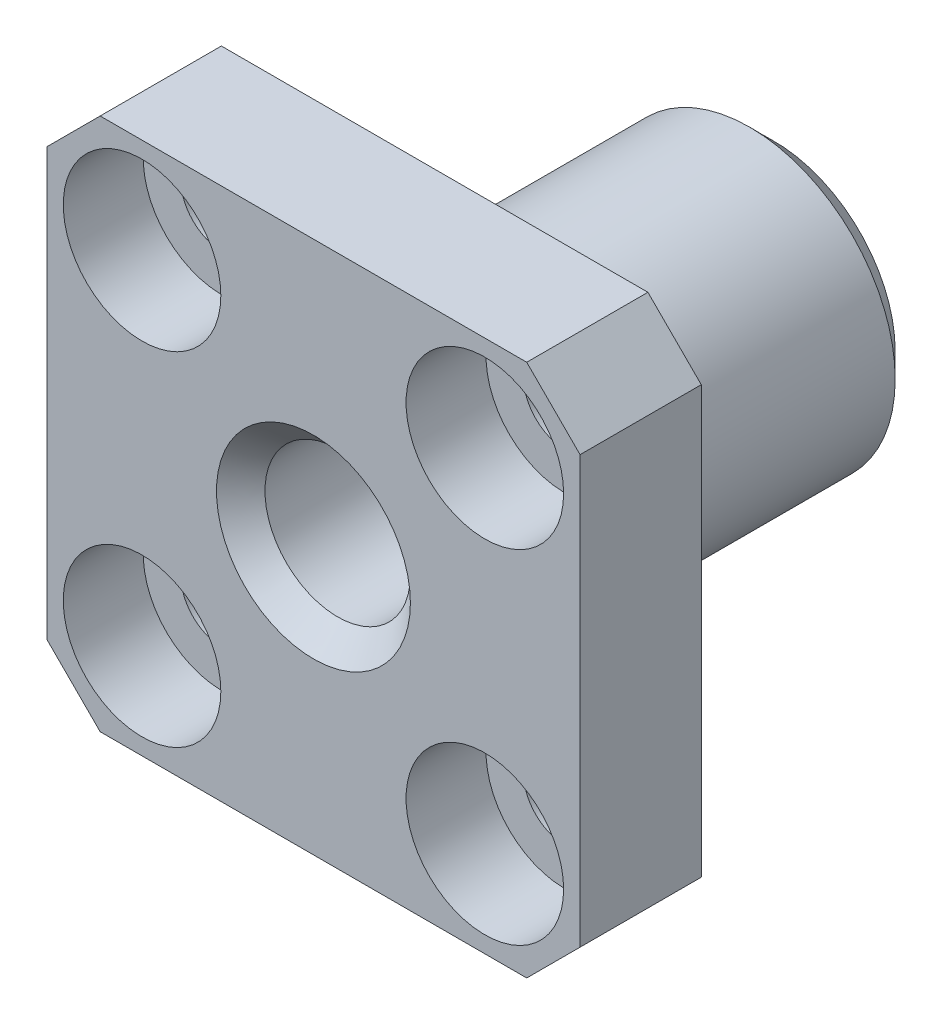
ISO-10303-21;
HEADER;
FILE_DESCRIPTION(('STEP AP214'),'2;1');
FILE_NAME('part.step','',(''),(''),'','','');
FILE_SCHEMA(('AUTOMOTIVE_DESIGN { 1 0 10303 214 1 1 1 1 }'));
ENDSEC;
DATA;
#1=APPLICATION_CONTEXT('core data for automotive mechanical design processes');
#2=APPLICATION_PROTOCOL_DEFINITION('international standard','automotive_design',2000,#1);
#3=PRODUCT_CONTEXT('',#1,'mechanical');
#4=PRODUCT('Part','Part','',(#3));
#5=PRODUCT_RELATED_PRODUCT_CATEGORY('part','',(#4));
#6=PRODUCT_DEFINITION_FORMATION('','',#4);
#7=PRODUCT_DEFINITION_CONTEXT('part definition',#1,'design');
#8=PRODUCT_DEFINITION('design','',#6,#7);
#9=PRODUCT_DEFINITION_SHAPE('','',#8);
#10=(LENGTH_UNIT() NAMED_UNIT(*) SI_UNIT(.MILLI.,.METRE.));
#11=(NAMED_UNIT(*) PLANE_ANGLE_UNIT() SI_UNIT($,.RADIAN.));
#12=(NAMED_UNIT(*) SI_UNIT($,.STERADIAN.) SOLID_ANGLE_UNIT());
#13=UNCERTAINTY_MEASURE_WITH_UNIT(LENGTH_MEASURE(1.E-05),#10,'distance_accuracy_value','');
#14=(GEOMETRIC_REPRESENTATION_CONTEXT(3) GLOBAL_UNCERTAINTY_ASSIGNED_CONTEXT((#13)) GLOBAL_UNIT_ASSIGNED_CONTEXT((#10,
#11,#12)) REPRESENTATION_CONTEXT('',''));
#15=CARTESIAN_POINT('',(0.,0.,0.));
#16=DIRECTION('',(0.,0.,1.));
#17=DIRECTION('',(1.,0.,0.));
#18=AXIS2_PLACEMENT_3D('',#15,#16,#17);
#19=CARTESIAN_POINT('',(0.,0.,19.));
#20=DIRECTION('',(0.,0.,-1.));
#21=DIRECTION('',(-1.,0.,0.));
#22=AXIS2_PLACEMENT_3D('',#19,#20,#21);
#23=CYLINDRICAL_SURFACE('',#22,6.);
#24=CARTESIAN_POINT('',(0.,0.,1.));
#25=DIRECTION('',(0.,0.,1.));
#26=DIRECTION('',(1.,0.,0.));
#27=AXIS2_PLACEMENT_3D('',#24,#25,#26);
#28=CIRCLE('',#27,6.);
#29=CARTESIAN_POINT('',(6.,0.,1.));
#30=VERTEX_POINT('',#29);
#31=EDGE_CURVE('E141',#30,#30,#28,.T.);
#32=ORIENTED_EDGE('',*,*,#31,.T.);
#33=EDGE_LOOP('',(#32));
#34=FACE_BOUND('',#33,.T.);
#35=CARTESIAN_POINT('',(0.,0.,14.));
#36=DIRECTION('',(0.,0.,-1.));
#37=DIRECTION('',(-1.,0.,0.));
#38=AXIS2_PLACEMENT_3D('',#35,#36,#37);
#39=CIRCLE('',#38,6.);
#40=CARTESIAN_POINT('',(-6.,0.,14.));
#41=VERTEX_POINT('',#40);
#42=EDGE_CURVE('E138',#41,#41,#39,.T.);
#43=ORIENTED_EDGE('',*,*,#42,.T.);
#44=EDGE_LOOP('',(#43));
#45=FACE_BOUND('',#44,.T.);
#46=ADVANCED_FACE('F33',(#34,#45),#23,.T.);
#47=CARTESIAN_POINT('',(0.,0.,0.));
#48=DIRECTION('',(0.,0.,1.));
#49=DIRECTION('',(1.,0.,0.));
#50=AXIS2_PLACEMENT_3D('',#47,#48,#49);
#51=PLANE('',#50);
#52=CARTESIAN_POINT('',(0.,0.,0.));
#53=DIRECTION('',(0.,0.,1.));
#54=DIRECTION('',(1.,0.,0.));
#55=AXIS2_PLACEMENT_3D('',#52,#53,#54);
#56=CIRCLE('',#55,4.99999999999999);
#57=CARTESIAN_POINT('',(4.99999999999999,0.,0.));
#58=VERTEX_POINT('',#57);
#59=EDGE_CURVE('E164',#58,#58,#56,.F.);
#60=ORIENTED_EDGE('',*,*,#59,.T.);
#61=EDGE_LOOP('',(#60));
#62=FACE_BOUND('',#61,.T.);
#63=CARTESIAN_POINT('',(0.,0.,0.));
#64=DIRECTION('',(0.,0.,1.));
#65=DIRECTION('',(1.,0.,0.));
#66=AXIS2_PLACEMENT_3D('',#63,#64,#65);
#67=CIRCLE('',#66,3.);
#68=CARTESIAN_POINT('',(3.,0.,0.));
#69=VERTEX_POINT('',#68);
#70=EDGE_CURVE('E442',#69,#69,#67,.T.);
#71=ORIENTED_EDGE('',*,*,#70,.T.);
#72=EDGE_LOOP('',(#71));
#73=FACE_BOUND('',#72,.T.);
#74=ADVANCED_FACE('F181',(#62,#73),#51,.F.);
#75=CARTESIAN_POINT('',(11.,-11.,14.));
#76=DIRECTION('',(1.,0.,0.));
#77=DIRECTION('',(0.,0.,-1.));
#78=AXIS2_PLACEMENT_3D('',#75,#76,#77);
#79=PLANE('',#78);
#80=DIRECTION('',(0.,0.,1.));
#81=VECTOR('',#80,1.);
#82=CARTESIAN_POINT('',(11.,-8.79898987322333,0.));
#83=LINE('',#82,#81);
#84=CARTESIAN_POINT('',(11.,-8.79898987322333,14.));
#85=VERTEX_POINT('',#84);
#86=CARTESIAN_POINT('',(11.,-8.79898987322333,19.));
#87=VERTEX_POINT('',#86);
#88=EDGE_CURVE('E474',#85,#87,#83,.T.);
#89=ORIENTED_EDGE('',*,*,#88,.F.);
#90=DIRECTION('',(0.,1.,0.));
#91=VECTOR('',#90,1.);
#92=CARTESIAN_POINT('',(11.,-11.,14.));
#93=LINE('',#92,#91);
#94=CARTESIAN_POINT('',(11.,8.79898987322333,14.));
#95=VERTEX_POINT('',#94);
#96=EDGE_CURVE('E117',#85,#95,#93,.T.);
#97=ORIENTED_EDGE('',*,*,#96,.T.);
#98=DIRECTION('',(0.,0.,1.));
#99=VECTOR('',#98,1.);
#100=CARTESIAN_POINT('',(11.,8.79898987322333,0.));
#101=LINE('',#100,#99);
#102=CARTESIAN_POINT('',(11.,8.79898987322333,19.));
#103=VERTEX_POINT('',#102);
#104=EDGE_CURVE('E100',#95,#103,#101,.T.);
#105=ORIENTED_EDGE('',*,*,#104,.T.);
#106=DIRECTION('',(0.,1.,0.));
#107=VECTOR('',#106,1.);
#108=CARTESIAN_POINT('',(11.,-11.,19.));
#109=LINE('',#108,#107);
#110=EDGE_CURVE('E115',#87,#103,#109,.T.);
#111=ORIENTED_EDGE('',*,*,#110,.F.);
#112=EDGE_LOOP('',(#89,#97,#105,#111));
#113=FACE_BOUND('',#112,.T.);
#114=ADVANCED_FACE('F114',(#113),#79,.T.);
#115=CARTESIAN_POINT('',(-11.,-11.,14.));
#116=DIRECTION('',(0.,-1.,0.));
#117=DIRECTION('',(0.,0.,-1.));
#118=AXIS2_PLACEMENT_3D('',#115,#116,#117);
#119=PLANE('',#118);
#120=DIRECTION('',(0.,0.,1.));
#121=VECTOR('',#120,1.);
#122=CARTESIAN_POINT('',(-8.79898987322333,-11.,0.));
#123=LINE('',#122,#121);
#124=CARTESIAN_POINT('',(-8.79898987322333,-11.,14.));
#125=VERTEX_POINT('',#124);
#126=CARTESIAN_POINT('',(-8.79898987322333,-11.,19.));
#127=VERTEX_POINT('',#126);
#128=EDGE_CURVE('E48',#125,#127,#123,.T.);
#129=ORIENTED_EDGE('',*,*,#128,.F.);
#130=DIRECTION('',(1.,0.,0.));
#131=VECTOR('',#130,1.);
#132=CARTESIAN_POINT('',(-11.,-11.,14.));
#133=LINE('',#132,#131);
#134=CARTESIAN_POINT('',(8.79898987322333,-11.,14.));
#135=VERTEX_POINT('',#134);
#136=EDGE_CURVE('E131',#125,#135,#133,.T.);
#137=ORIENTED_EDGE('',*,*,#136,.T.);
#138=DIRECTION('',(0.,0.,1.));
#139=VECTOR('',#138,1.);
#140=CARTESIAN_POINT('',(8.79898987322333,-11.,0.));
#141=LINE('',#140,#139);
#142=CARTESIAN_POINT('',(8.79898987322333,-11.,19.));
#143=VERTEX_POINT('',#142);
#144=EDGE_CURVE('E108',#135,#143,#141,.T.);
#145=ORIENTED_EDGE('',*,*,#144,.T.);
#146=DIRECTION('',(1.,0.,0.));
#147=VECTOR('',#146,1.);
#148=CARTESIAN_POINT('',(-11.,-11.,19.));
#149=LINE('',#148,#147);
#150=EDGE_CURVE('E136',#127,#143,#149,.T.);
#151=ORIENTED_EDGE('',*,*,#150,.F.);
#152=EDGE_LOOP('',(#129,#137,#145,#151));
#153=FACE_BOUND('',#152,.T.);
#154=ADVANCED_FACE('F198',(#153),#119,.T.);
#155=CARTESIAN_POINT('',(-11.,-11.,14.));
#156=DIRECTION('',(-1.,0.,0.));
#157=DIRECTION('',(0.,0.,1.));
#158=AXIS2_PLACEMENT_3D('',#155,#156,#157);
#159=PLANE('',#158);
#160=DIRECTION('',(0.,0.,1.));
#161=VECTOR('',#160,1.);
#162=CARTESIAN_POINT('',(-11.,-8.79898987322333,0.));
#163=LINE('',#162,#161);
#164=CARTESIAN_POINT('',(-11.,-8.79898987322333,14.));
#165=VERTEX_POINT('',#164);
#166=CARTESIAN_POINT('',(-11.,-8.79898987322333,19.));
#167=VERTEX_POINT('',#166);
#168=EDGE_CURVE('E479',#165,#167,#163,.T.);
#169=ORIENTED_EDGE('',*,*,#168,.T.);
#170=DIRECTION('',(0.,-1.,0.));
#171=VECTOR('',#170,1.);
#172=CARTESIAN_POINT('',(-11.,-11.,19.));
#173=LINE('',#172,#171);
#174=CARTESIAN_POINT('',(-11.,8.79898987322332,19.));
#175=VERTEX_POINT('',#174);
#176=EDGE_CURVE('E126',#175,#167,#173,.T.);
#177=ORIENTED_EDGE('',*,*,#176,.F.);
#178=DIRECTION('',(0.,0.,1.));
#179=VECTOR('',#178,1.);
#180=CARTESIAN_POINT('',(-11.,8.79898987322333,0.));
#181=LINE('',#180,#179);
#182=CARTESIAN_POINT('',(-11.,8.79898987322333,14.));
#183=VERTEX_POINT('',#182);
#184=EDGE_CURVE('E56',#183,#175,#181,.T.);
#185=ORIENTED_EDGE('',*,*,#184,.F.);
#186=DIRECTION('',(0.,-1.,0.));
#187=VECTOR('',#186,1.);
#188=CARTESIAN_POINT('',(-11.,-11.,14.));
#189=LINE('',#188,#187);
#190=EDGE_CURVE('E496',#183,#165,#189,.T.);
#191=ORIENTED_EDGE('',*,*,#190,.T.);
#192=EDGE_LOOP('',(#169,#177,#185,#191));
#193=FACE_BOUND('',#192,.T.);
#194=ADVANCED_FACE('F202',(#193),#159,.T.);
#195=CARTESIAN_POINT('',(-11.,11.,14.));
#196=DIRECTION('',(0.,1.,0.));
#197=DIRECTION('',(0.,0.,1.));
#198=AXIS2_PLACEMENT_3D('',#195,#196,#197);
#199=PLANE('',#198);
#200=DIRECTION('',(0.,0.,1.));
#201=VECTOR('',#200,1.);
#202=CARTESIAN_POINT('',(8.79898987322333,11.,0.));
#203=LINE('',#202,#201);
#204=CARTESIAN_POINT('',(8.79898987322333,11.,14.));
#205=VERTEX_POINT('',#204);
#206=CARTESIAN_POINT('',(8.79898987322333,11.,19.));
#207=VERTEX_POINT('',#206);
#208=EDGE_CURVE('E103',#205,#207,#203,.T.);
#209=ORIENTED_EDGE('',*,*,#208,.F.);
#210=DIRECTION('',(-1.,0.,0.));
#211=VECTOR('',#210,1.);
#212=CARTESIAN_POINT('',(-11.,11.,14.));
#213=LINE('',#212,#211);
#214=CARTESIAN_POINT('',(-8.79898987322333,11.,14.));
#215=VERTEX_POINT('',#214);
#216=EDGE_CURVE('E494',#205,#215,#213,.T.);
#217=ORIENTED_EDGE('',*,*,#216,.T.);
#218=DIRECTION('',(0.,0.,1.));
#219=VECTOR('',#218,1.);
#220=CARTESIAN_POINT('',(-8.79898987322333,11.,0.));
#221=LINE('',#220,#219);
#222=CARTESIAN_POINT('',(-8.79898987322333,11.,19.));
#223=VERTEX_POINT('',#222);
#224=EDGE_CURVE('E484',#215,#223,#221,.T.);
#225=ORIENTED_EDGE('',*,*,#224,.T.);
#226=DIRECTION('',(-1.,0.,0.));
#227=VECTOR('',#226,1.);
#228=CARTESIAN_POINT('',(-11.,11.,19.));
#229=LINE('',#228,#227);
#230=EDGE_CURVE('E123',#207,#223,#229,.T.);
#231=ORIENTED_EDGE('',*,*,#230,.F.);
#232=EDGE_LOOP('',(#209,#217,#225,#231));
#233=FACE_BOUND('',#232,.T.);
#234=ADVANCED_FACE('F199',(#233),#199,.T.);
#235=CARTESIAN_POINT('',(0.,0.,14.));
#236=DIRECTION('',(0.,0.,-1.));
#237=DIRECTION('',(-1.,0.,0.));
#238=AXIS2_PLACEMENT_3D('',#235,#236,#237);
#239=PLANE('',#238);
#240=CARTESIAN_POINT('',(-7.07106781186548,7.07106781186548,14.));
#241=DIRECTION('',(0.,0.,-1.));
#242=DIRECTION('',(-1.,0.,0.));
#243=AXIS2_PLACEMENT_3D('',#240,#241,#242);
#244=CIRCLE('',#243,1.7);
#245=CARTESIAN_POINT('',(-8.77106781186547,7.07106781186548,14.));
#246=VERTEX_POINT('',#245);
#247=EDGE_CURVE('E157',#246,#246,#244,.T.);
#248=ORIENTED_EDGE('',*,*,#247,.F.);
#249=EDGE_LOOP('',(#248));
#250=FACE_BOUND('',#249,.T.);
#251=CARTESIAN_POINT('',(7.07106781186548,7.07106781186548,14.));
#252=DIRECTION('',(0.,0.,-1.));
#253=DIRECTION('',(-1.,0.,0.));
#254=AXIS2_PLACEMENT_3D('',#251,#252,#253);
#255=CIRCLE('',#254,1.7);
#256=CARTESIAN_POINT('',(5.37106781186548,7.07106781186548,14.));
#257=VERTEX_POINT('',#256);
#258=EDGE_CURVE('E152',#257,#257,#255,.T.);
#259=ORIENTED_EDGE('',*,*,#258,.F.);
#260=EDGE_LOOP('',(#259));
#261=FACE_BOUND('',#260,.T.);
#262=CARTESIAN_POINT('',(7.07106781186548,-7.07106781186548,14.));
#263=DIRECTION('',(0.,0.,-1.));
#264=DIRECTION('',(-1.,0.,0.));
#265=AXIS2_PLACEMENT_3D('',#262,#263,#264);
#266=CIRCLE('',#265,1.7);
#267=CARTESIAN_POINT('',(5.37106781186548,-7.07106781186548,14.));
#268=VERTEX_POINT('',#267);
#269=EDGE_CURVE('E147',#268,#268,#266,.T.);
#270=ORIENTED_EDGE('',*,*,#269,.F.);
#271=EDGE_LOOP('',(#270));
#272=FACE_BOUND('',#271,.T.);
#273=CARTESIAN_POINT('',(-7.07106781186548,-7.07106781186548,14.));
#274=DIRECTION('',(0.,0.,-1.));
#275=DIRECTION('',(-1.,0.,0.));
#276=AXIS2_PLACEMENT_3D('',#273,#274,#275);
#277=CIRCLE('',#276,1.7);
#278=CARTESIAN_POINT('',(-8.77106781186547,-7.07106781186548,14.));
#279=VERTEX_POINT('',#278);
#280=EDGE_CURVE('E142',#279,#279,#277,.T.);
#281=ORIENTED_EDGE('',*,*,#280,.F.);
#282=EDGE_LOOP('',(#281));
#283=FACE_BOUND('',#282,.T.);
#284=DIRECTION('',(0.707106781186548,-0.707106781186548,0.));
#285=VECTOR('',#284,1.);
#286=CARTESIAN_POINT('',(-9.89949493661166,-9.89949493661166,14.));
#287=LINE('',#286,#285);
#288=EDGE_CURVE('E124',#165,#125,#287,.T.);
#289=ORIENTED_EDGE('',*,*,#288,.F.);
#290=ORIENTED_EDGE('',*,*,#190,.F.);
#291=DIRECTION('',(-0.707106781186548,-0.707106781186548,0.));
#292=VECTOR('',#291,1.);
#293=CARTESIAN_POINT('',(-9.89949493661166,9.89949493661166,14.));
#294=LINE('',#293,#292);
#295=EDGE_CURVE('E487',#215,#183,#294,.T.);
#296=ORIENTED_EDGE('',*,*,#295,.F.);
#297=ORIENTED_EDGE('',*,*,#216,.F.);
#298=DIRECTION('',(-0.707106781186548,0.707106781186548,0.));
#299=VECTOR('',#298,1.);
#300=CARTESIAN_POINT('',(9.89949493661166,9.89949493661166,14.));
#301=LINE('',#300,#299);
#302=EDGE_CURVE('E490',#95,#205,#301,.T.);
#303=ORIENTED_EDGE('',*,*,#302,.F.);
#304=ORIENTED_EDGE('',*,*,#96,.F.);
#305=DIRECTION('',(0.707106781186548,0.707106781186548,0.));
#306=VECTOR('',#305,1.);
#307=CARTESIAN_POINT('',(9.89949493661166,-9.89949493661166,14.));
#308=LINE('',#307,#306);
#309=EDGE_CURVE('E128',#135,#85,#308,.T.);
#310=ORIENTED_EDGE('',*,*,#309,.F.);
#311=ORIENTED_EDGE('',*,*,#136,.F.);
#312=EDGE_LOOP('',(#289,#290,#296,#297,#303,#304,#310,#311));
#313=FACE_BOUND('',#312,.T.);
#314=ORIENTED_EDGE('',*,*,#42,.F.);
#315=EDGE_LOOP('',(#314));
#316=FACE_BOUND('',#315,.T.);
#317=ADVANCED_FACE('F194',(#250,#261,#272,#283,#313,#316),#239,.T.);
#318=CARTESIAN_POINT('',(0.,0.,19.));
#319=DIRECTION('',(0.,0.,1.));
#320=DIRECTION('',(1.,0.,0.));
#321=AXIS2_PLACEMENT_3D('',#318,#319,#320);
#322=PLANE('',#321);
#323=CARTESIAN_POINT('',(0.,0.,19.));
#324=DIRECTION('',(0.,0.,1.));
#325=DIRECTION('',(1.,0.,0.));
#326=AXIS2_PLACEMENT_3D('',#323,#324,#325);
#327=CIRCLE('',#326,4.);
#328=CARTESIAN_POINT('',(4.,0.,19.));
#329=VERTEX_POINT('',#328);
#330=EDGE_CURVE('E11',#329,#329,#327,.F.);
#331=ORIENTED_EDGE('',*,*,#330,.T.);
#332=EDGE_LOOP('',(#331));
#333=FACE_BOUND('',#332,.T.);
#334=CARTESIAN_POINT('',(-7.07106781186548,7.07106781186548,19.));
#335=DIRECTION('',(0.,0.,1.));
#336=DIRECTION('',(1.,0.,0.));
#337=AXIS2_PLACEMENT_3D('',#334,#335,#336);
#338=CIRCLE('',#337,3.25);
#339=CARTESIAN_POINT('',(-3.82106781186548,7.07106781186548,19.));
#340=VERTEX_POINT('',#339);
#341=EDGE_CURVE('E440',#340,#340,#338,.T.);
#342=ORIENTED_EDGE('',*,*,#341,.F.);
#343=EDGE_LOOP('',(#342));
#344=FACE_BOUND('',#343,.T.);
#345=CARTESIAN_POINT('',(7.07106781186548,7.07106781186548,19.));
#346=DIRECTION('',(0.,0.,1.));
#347=DIRECTION('',(1.,0.,0.));
#348=AXIS2_PLACEMENT_3D('',#345,#346,#347);
#349=CIRCLE('',#348,3.25);
#350=CARTESIAN_POINT('',(10.3210678118655,7.07106781186548,19.));
#351=VERTEX_POINT('',#350);
#352=EDGE_CURVE('E160',#351,#351,#349,.T.);
#353=ORIENTED_EDGE('',*,*,#352,.F.);
#354=EDGE_LOOP('',(#353));
#355=FACE_BOUND('',#354,.T.);
#356=CARTESIAN_POINT('',(7.07106781186548,-7.07106781186548,19.));
#357=DIRECTION('',(0.,0.,1.));
#358=DIRECTION('',(1.,0.,0.));
#359=AXIS2_PLACEMENT_3D('',#356,#357,#358);
#360=CIRCLE('',#359,3.25);
#361=CARTESIAN_POINT('',(10.3210678118655,-7.07106781186548,19.));
#362=VERTEX_POINT('',#361);
#363=EDGE_CURVE('E155',#362,#362,#360,.T.);
#364=ORIENTED_EDGE('',*,*,#363,.F.);
#365=EDGE_LOOP('',(#364));
#366=FACE_BOUND('',#365,.T.);
#367=CARTESIAN_POINT('',(-7.07106781186548,-7.07106781186548,19.));
#368=DIRECTION('',(0.,0.,1.));
#369=DIRECTION('',(1.,0.,0.));
#370=AXIS2_PLACEMENT_3D('',#367,#368,#369);
#371=CIRCLE('',#370,3.25);
#372=CARTESIAN_POINT('',(-3.82106781186548,-7.07106781186548,19.));
#373=VERTEX_POINT('',#372);
#374=EDGE_CURVE('E150',#373,#373,#371,.T.);
#375=ORIENTED_EDGE('',*,*,#374,.F.);
#376=EDGE_LOOP('',(#375));
#377=FACE_BOUND('',#376,.T.);
#378=DIRECTION('',(-0.707106781186547,0.707106781186547,0.));
#379=VECTOR('',#378,1.);
#380=CARTESIAN_POINT('',(-11.,-8.79898987322333,19.));
#381=LINE('',#380,#379);
#382=EDGE_CURVE('E145',#127,#167,#381,.T.);
#383=ORIENTED_EDGE('',*,*,#382,.F.);
#384=ORIENTED_EDGE('',*,*,#150,.T.);
#385=DIRECTION('',(-0.707106781186547,-0.707106781186547,0.));
#386=VECTOR('',#385,1.);
#387=CARTESIAN_POINT('',(11.,-8.79898987322333,19.));
#388=LINE('',#387,#386);
#389=EDGE_CURVE('E122',#87,#143,#388,.T.);
#390=ORIENTED_EDGE('',*,*,#389,.F.);
#391=ORIENTED_EDGE('',*,*,#110,.T.);
#392=DIRECTION('',(0.707106781186547,-0.707106781186547,0.));
#393=VECTOR('',#392,1.);
#394=CARTESIAN_POINT('',(11.,8.79898987322333,19.));
#395=LINE('',#394,#393);
#396=EDGE_CURVE('E97',#207,#103,#395,.T.);
#397=ORIENTED_EDGE('',*,*,#396,.F.);
#398=ORIENTED_EDGE('',*,*,#230,.T.);
#399=DIRECTION('',(0.707106781186547,0.707106781186547,0.));
#400=VECTOR('',#399,1.);
#401=CARTESIAN_POINT('',(-11.,8.79898987322333,19.));
#402=LINE('',#401,#400);
#403=EDGE_CURVE('E471',#175,#223,#402,.T.);
#404=ORIENTED_EDGE('',*,*,#403,.F.);
#405=ORIENTED_EDGE('',*,*,#176,.T.);
#406=EDGE_LOOP('',(#383,#384,#390,#391,#397,#398,#404,#405));
#407=FACE_BOUND('',#406,.T.);
#408=ADVANCED_FACE('F120',(#333,#344,#355,#366,#377,#407),#322,.T.);
#409=CARTESIAN_POINT('',(-11.,8.79898987322333,0.));
#410=DIRECTION('',(0.707106781186548,-0.707106781186548,0.));
#411=DIRECTION('',(0.707106781186548,0.707106781186548,0.));
#412=AXIS2_PLACEMENT_3D('',#409,#410,#411);
#413=PLANE('',#412);
#414=ORIENTED_EDGE('',*,*,#295,.T.);
#415=ORIENTED_EDGE('',*,*,#184,.T.);
#416=ORIENTED_EDGE('',*,*,#403,.T.);
#417=ORIENTED_EDGE('',*,*,#224,.F.);
#418=EDGE_LOOP('',(#414,#415,#416,#417));
#419=FACE_BOUND('',#418,.T.);
#420=ADVANCED_FACE('F193',(#419),#413,.F.);
#421=CARTESIAN_POINT('',(11.,8.79898987322333,0.));
#422=DIRECTION('',(-0.707106781186548,-0.707106781186548,0.));
#423=DIRECTION('',(0.707106781186548,-0.707106781186548,0.));
#424=AXIS2_PLACEMENT_3D('',#421,#422,#423);
#425=PLANE('',#424);
#426=ORIENTED_EDGE('',*,*,#302,.T.);
#427=ORIENTED_EDGE('',*,*,#208,.T.);
#428=ORIENTED_EDGE('',*,*,#396,.T.);
#429=ORIENTED_EDGE('',*,*,#104,.F.);
#430=EDGE_LOOP('',(#426,#427,#428,#429));
#431=FACE_BOUND('',#430,.T.);
#432=ADVANCED_FACE('F99',(#431),#425,.F.);
#433=CARTESIAN_POINT('',(11.,-8.79898987322333,0.));
#434=DIRECTION('',(-0.707106781186548,0.707106781186548,0.));
#435=DIRECTION('',(-0.707106781186548,-0.707106781186548,0.));
#436=AXIS2_PLACEMENT_3D('',#433,#434,#435);
#437=PLANE('',#436);
#438=ORIENTED_EDGE('',*,*,#309,.T.);
#439=ORIENTED_EDGE('',*,*,#88,.T.);
#440=ORIENTED_EDGE('',*,*,#389,.T.);
#441=ORIENTED_EDGE('',*,*,#144,.F.);
#442=EDGE_LOOP('',(#438,#439,#440,#441));
#443=FACE_BOUND('',#442,.T.);
#444=ADVANCED_FACE('F219',(#443),#437,.F.);
#445=CARTESIAN_POINT('',(-11.,-8.79898987322333,0.));
#446=DIRECTION('',(0.707106781186548,0.707106781186548,0.));
#447=DIRECTION('',(-0.707106781186548,0.707106781186548,0.));
#448=AXIS2_PLACEMENT_3D('',#445,#446,#447);
#449=PLANE('',#448);
#450=ORIENTED_EDGE('',*,*,#288,.T.);
#451=ORIENTED_EDGE('',*,*,#128,.T.);
#452=ORIENTED_EDGE('',*,*,#382,.T.);
#453=ORIENTED_EDGE('',*,*,#168,.F.);
#454=EDGE_LOOP('',(#450,#451,#452,#453));
#455=FACE_BOUND('',#454,.T.);
#456=ADVANCED_FACE('F215',(#455),#449,.F.);
#457=CARTESIAN_POINT('',(-7.07106781186548,-7.07106781186548,19.));
#458=DIRECTION('',(0.,0.,1.));
#459=DIRECTION('',(1.,0.,0.));
#460=AXIS2_PLACEMENT_3D('',#457,#458,#459);
#461=CYLINDRICAL_SURFACE('',#460,1.7);
#462=ORIENTED_EDGE('',*,*,#280,.T.);
#463=EDGE_LOOP('',(#462));
#464=FACE_BOUND('',#463,.T.);
#465=CARTESIAN_POINT('',(-7.07106781186548,-7.07106781186548,15.7));
#466=DIRECTION('',(0.,0.,1.));
#467=DIRECTION('',(1.,0.,0.));
#468=AXIS2_PLACEMENT_3D('',#465,#466,#467);
#469=CIRCLE('',#468,1.7);
#470=CARTESIAN_POINT('',(-5.37106781186548,-7.07106781186548,15.7));
#471=VERTEX_POINT('',#470);
#472=EDGE_CURVE('E146',#471,#471,#469,.T.);
#473=ORIENTED_EDGE('',*,*,#472,.T.);
#474=EDGE_LOOP('',(#473));
#475=FACE_BOUND('',#474,.T.);
#476=ADVANCED_FACE('F218',(#464,#475),#461,.F.);
#477=CARTESIAN_POINT('',(-5.37106781186548,-7.07106781186548,15.7));
#478=DIRECTION('',(0.,0.,-1.));
#479=DIRECTION('',(-1.,0.,0.));
#480=AXIS2_PLACEMENT_3D('',#477,#478,#479);
#481=PLANE('',#480);
#482=ORIENTED_EDGE('',*,*,#472,.F.);
#483=EDGE_LOOP('',(#482));
#484=FACE_BOUND('',#483,.T.);
#485=CARTESIAN_POINT('',(-7.07106781186548,-7.07106781186548,15.7));
#486=DIRECTION('',(0.,0.,1.));
#487=DIRECTION('',(1.,0.,0.));
#488=AXIS2_PLACEMENT_3D('',#485,#486,#487);
#489=CIRCLE('',#488,3.25);
#490=CARTESIAN_POINT('',(-3.82106781186548,-7.07106781186548,15.7));
#491=VERTEX_POINT('',#490);
#492=EDGE_CURVE('E466',#491,#491,#489,.T.);
#493=ORIENTED_EDGE('',*,*,#492,.T.);
#494=EDGE_LOOP('',(#493));
#495=FACE_BOUND('',#494,.T.);
#496=ADVANCED_FACE('F227',(#484,#495),#481,.F.);
#497=CARTESIAN_POINT('',(-7.07106781186548,-7.07106781186548,19.));
#498=DIRECTION('',(0.,0.,1.));
#499=DIRECTION('',(1.,0.,0.));
#500=AXIS2_PLACEMENT_3D('',#497,#498,#499);
#501=CYLINDRICAL_SURFACE('',#500,3.25);
#502=ORIENTED_EDGE('',*,*,#492,.F.);
#503=EDGE_LOOP('',(#502));
#504=FACE_BOUND('',#503,.T.);
#505=ORIENTED_EDGE('',*,*,#374,.T.);
#506=EDGE_LOOP('',(#505));
#507=FACE_BOUND('',#506,.T.);
#508=ADVANCED_FACE('F231',(#504,#507),#501,.F.);
#509=CARTESIAN_POINT('',(7.07106781186548,-7.07106781186548,19.));
#510=DIRECTION('',(0.,0.,1.));
#511=DIRECTION('',(1.,0.,0.));
#512=AXIS2_PLACEMENT_3D('',#509,#510,#511);
#513=CYLINDRICAL_SURFACE('',#512,1.7);
#514=ORIENTED_EDGE('',*,*,#269,.T.);
#515=EDGE_LOOP('',(#514));
#516=FACE_BOUND('',#515,.T.);
#517=CARTESIAN_POINT('',(7.07106781186548,-7.07106781186548,15.7));
#518=DIRECTION('',(0.,0.,1.));
#519=DIRECTION('',(1.,0.,0.));
#520=AXIS2_PLACEMENT_3D('',#517,#518,#519);
#521=CIRCLE('',#520,1.7);
#522=CARTESIAN_POINT('',(8.77106781186547,-7.07106781186548,15.7));
#523=VERTEX_POINT('',#522);
#524=EDGE_CURVE('E151',#523,#523,#521,.T.);
#525=ORIENTED_EDGE('',*,*,#524,.T.);
#526=EDGE_LOOP('',(#525));
#527=FACE_BOUND('',#526,.T.);
#528=ADVANCED_FACE('F235',(#516,#527),#513,.F.);
#529=CARTESIAN_POINT('',(8.77106781186547,-7.07106781186548,15.7));
#530=DIRECTION('',(0.,0.,-1.));
#531=DIRECTION('',(-1.,0.,0.));
#532=AXIS2_PLACEMENT_3D('',#529,#530,#531);
#533=PLANE('',#532);
#534=ORIENTED_EDGE('',*,*,#524,.F.);
#535=EDGE_LOOP('',(#534));
#536=FACE_BOUND('',#535,.T.);
#537=CARTESIAN_POINT('',(7.07106781186548,-7.07106781186548,15.7));
#538=DIRECTION('',(0.,0.,1.));
#539=DIRECTION('',(1.,0.,0.));
#540=AXIS2_PLACEMENT_3D('',#537,#538,#539);
#541=CIRCLE('',#540,3.25);
#542=CARTESIAN_POINT('',(10.3210678118655,-7.07106781186548,15.7));
#543=VERTEX_POINT('',#542);
#544=EDGE_CURVE('E459',#543,#543,#541,.T.);
#545=ORIENTED_EDGE('',*,*,#544,.T.);
#546=EDGE_LOOP('',(#545));
#547=FACE_BOUND('',#546,.T.);
#548=ADVANCED_FACE('F239',(#536,#547),#533,.F.);
#549=CARTESIAN_POINT('',(7.07106781186548,-7.07106781186548,19.));
#550=DIRECTION('',(0.,0.,1.));
#551=DIRECTION('',(1.,0.,0.));
#552=AXIS2_PLACEMENT_3D('',#549,#550,#551);
#553=CYLINDRICAL_SURFACE('',#552,3.25);
#554=ORIENTED_EDGE('',*,*,#544,.F.);
#555=EDGE_LOOP('',(#554));
#556=FACE_BOUND('',#555,.T.);
#557=ORIENTED_EDGE('',*,*,#363,.T.);
#558=EDGE_LOOP('',(#557));
#559=FACE_BOUND('',#558,.T.);
#560=ADVANCED_FACE('F243',(#556,#559),#553,.F.);
#561=CARTESIAN_POINT('',(7.07106781186548,7.07106781186548,19.));
#562=DIRECTION('',(0.,0.,1.));
#563=DIRECTION('',(1.,0.,0.));
#564=AXIS2_PLACEMENT_3D('',#561,#562,#563);
#565=CYLINDRICAL_SURFACE('',#564,1.7);
#566=ORIENTED_EDGE('',*,*,#258,.T.);
#567=EDGE_LOOP('',(#566));
#568=FACE_BOUND('',#567,.T.);
#569=CARTESIAN_POINT('',(7.07106781186548,7.07106781186548,15.7));
#570=DIRECTION('',(0.,0.,1.));
#571=DIRECTION('',(1.,0.,0.));
#572=AXIS2_PLACEMENT_3D('',#569,#570,#571);
#573=CIRCLE('',#572,1.7);
#574=CARTESIAN_POINT('',(8.77106781186547,7.07106781186548,15.7));
#575=VERTEX_POINT('',#574);
#576=EDGE_CURVE('E156',#575,#575,#573,.T.);
#577=ORIENTED_EDGE('',*,*,#576,.T.);
#578=EDGE_LOOP('',(#577));
#579=FACE_BOUND('',#578,.T.);
#580=ADVANCED_FACE('F247',(#568,#579),#565,.F.);
#581=CARTESIAN_POINT('',(8.77106781186547,7.07106781186548,15.7));
#582=DIRECTION('',(0.,0.,-1.));
#583=DIRECTION('',(-1.,0.,0.));
#584=AXIS2_PLACEMENT_3D('',#581,#582,#583);
#585=PLANE('',#584);
#586=ORIENTED_EDGE('',*,*,#576,.F.);
#587=EDGE_LOOP('',(#586));
#588=FACE_BOUND('',#587,.T.);
#589=CARTESIAN_POINT('',(7.07106781186548,7.07106781186548,15.7));
#590=DIRECTION('',(0.,0.,1.));
#591=DIRECTION('',(1.,0.,0.));
#592=AXIS2_PLACEMENT_3D('',#589,#590,#591);
#593=CIRCLE('',#592,3.25);
#594=CARTESIAN_POINT('',(10.3210678118655,7.07106781186548,15.7));
#595=VERTEX_POINT('',#594);
#596=EDGE_CURVE('E452',#595,#595,#593,.T.);
#597=ORIENTED_EDGE('',*,*,#596,.T.);
#598=EDGE_LOOP('',(#597));
#599=FACE_BOUND('',#598,.T.);
#600=ADVANCED_FACE('F251',(#588,#599),#585,.F.);
#601=CARTESIAN_POINT('',(7.07106781186548,7.07106781186548,19.));
#602=DIRECTION('',(0.,0.,1.));
#603=DIRECTION('',(1.,0.,0.));
#604=AXIS2_PLACEMENT_3D('',#601,#602,#603);
#605=CYLINDRICAL_SURFACE('',#604,3.25);
#606=ORIENTED_EDGE('',*,*,#596,.F.);
#607=EDGE_LOOP('',(#606));
#608=FACE_BOUND('',#607,.T.);
#609=ORIENTED_EDGE('',*,*,#352,.T.);
#610=EDGE_LOOP('',(#609));
#611=FACE_BOUND('',#610,.T.);
#612=ADVANCED_FACE('F255',(#608,#611),#605,.F.);
#613=CARTESIAN_POINT('',(-7.07106781186548,7.07106781186548,19.));
#614=DIRECTION('',(0.,0.,1.));
#615=DIRECTION('',(1.,0.,0.));
#616=AXIS2_PLACEMENT_3D('',#613,#614,#615);
#617=CYLINDRICAL_SURFACE('',#616,1.7);
#618=ORIENTED_EDGE('',*,*,#247,.T.);
#619=EDGE_LOOP('',(#618));
#620=FACE_BOUND('',#619,.T.);
#621=CARTESIAN_POINT('',(-7.07106781186548,7.07106781186548,15.7));
#622=DIRECTION('',(0.,0.,1.));
#623=DIRECTION('',(1.,0.,0.));
#624=AXIS2_PLACEMENT_3D('',#621,#622,#623);
#625=CIRCLE('',#624,1.7);
#626=CARTESIAN_POINT('',(-5.37106781186548,7.07106781186548,15.7));
#627=VERTEX_POINT('',#626);
#628=EDGE_CURVE('E161',#627,#627,#625,.T.);
#629=ORIENTED_EDGE('',*,*,#628,.T.);
#630=EDGE_LOOP('',(#629));
#631=FACE_BOUND('',#630,.T.);
#632=ADVANCED_FACE('F259',(#620,#631),#617,.F.);
#633=CARTESIAN_POINT('',(-5.37106781186548,7.07106781186548,15.7));
#634=DIRECTION('',(0.,0.,-1.));
#635=DIRECTION('',(-1.,0.,0.));
#636=AXIS2_PLACEMENT_3D('',#633,#634,#635);
#637=PLANE('',#636);
#638=ORIENTED_EDGE('',*,*,#628,.F.);
#639=EDGE_LOOP('',(#638));
#640=FACE_BOUND('',#639,.T.);
#641=CARTESIAN_POINT('',(-7.07106781186548,7.07106781186548,15.7));
#642=DIRECTION('',(0.,0.,1.));
#643=DIRECTION('',(1.,0.,0.));
#644=AXIS2_PLACEMENT_3D('',#641,#642,#643);
#645=CIRCLE('',#644,3.25);
#646=CARTESIAN_POINT('',(-3.82106781186548,7.07106781186548,15.7));
#647=VERTEX_POINT('',#646);
#648=EDGE_CURVE('E437',#647,#647,#645,.T.);
#649=ORIENTED_EDGE('',*,*,#648,.T.);
#650=EDGE_LOOP('',(#649));
#651=FACE_BOUND('',#650,.T.);
#652=ADVANCED_FACE('F263',(#640,#651),#637,.F.);
#653=CARTESIAN_POINT('',(-7.07106781186548,7.07106781186548,19.));
#654=DIRECTION('',(0.,0.,1.));
#655=DIRECTION('',(1.,0.,0.));
#656=AXIS2_PLACEMENT_3D('',#653,#654,#655);
#657=CYLINDRICAL_SURFACE('',#656,3.25);
#658=ORIENTED_EDGE('',*,*,#648,.F.);
#659=EDGE_LOOP('',(#658));
#660=FACE_BOUND('',#659,.T.);
#661=ORIENTED_EDGE('',*,*,#341,.T.);
#662=EDGE_LOOP('',(#661));
#663=FACE_BOUND('',#662,.T.);
#664=ADVANCED_FACE('F267',(#660,#663),#657,.F.);
#665=CARTESIAN_POINT('',(0.,0.,0.));
#666=DIRECTION('',(0.,0.,1.));
#667=DIRECTION('',(1.,0.,0.));
#668=AXIS2_PLACEMENT_3D('',#665,#666,#667);
#669=CYLINDRICAL_SURFACE('',#668,3.);
#670=CARTESIAN_POINT('',(0.,0.,18.));
#671=DIRECTION('',(0.,0.,1.));
#672=DIRECTION('',(1.,0.,0.));
#673=AXIS2_PLACEMENT_3D('',#670,#671,#672);
#674=CIRCLE('',#673,3.);
#675=CARTESIAN_POINT('',(3.,0.,18.));
#676=VERTEX_POINT('',#675);
#677=EDGE_CURVE('E41',#676,#676,#674,.T.);
#678=ORIENTED_EDGE('',*,*,#677,.T.);
#679=EDGE_LOOP('',(#678));
#680=FACE_BOUND('',#679,.T.);
#681=ORIENTED_EDGE('',*,*,#70,.F.);
#682=EDGE_LOOP('',(#681));
#683=FACE_BOUND('',#682,.T.);
#684=ADVANCED_FACE('F169',(#680,#683),#669,.F.);
#685=CARTESIAN_POINT('',(0.,0.,1.));
#686=DIRECTION('',(0.,0.,1.));
#687=DIRECTION('',(1.,0.,0.));
#688=AXIS2_PLACEMENT_3D('',#685,#686,#687);
#689=CONICAL_SURFACE('',#688,6.,0.785398163397451);
#690=ORIENTED_EDGE('',*,*,#59,.F.);
#691=EDGE_LOOP('',(#690));
#692=FACE_BOUND('',#691,.T.);
#693=ORIENTED_EDGE('',*,*,#31,.F.);
#694=EDGE_LOOP('',(#693));
#695=FACE_BOUND('',#694,.T.);
#696=ADVANCED_FACE('F173',(#692,#695),#689,.T.);
#697=CARTESIAN_POINT('',(0.,0.,18.));
#698=DIRECTION('',(0.,0.,1.));
#699=DIRECTION('',(1.,0.,0.));
#700=AXIS2_PLACEMENT_3D('',#697,#698,#699);
#701=CONICAL_SURFACE('',#700,3.,0.785398163397451);
#702=ORIENTED_EDGE('',*,*,#330,.F.);
#703=EDGE_LOOP('',(#702));
#704=FACE_BOUND('',#703,.T.);
#705=ORIENTED_EDGE('',*,*,#677,.F.);
#706=EDGE_LOOP('',(#705));
#707=FACE_BOUND('',#706,.T.);
#708=ADVANCED_FACE('F35',(#704,#707),#701,.F.);
#709=CLOSED_SHELL('',(#46,#74,#114,#154,#194,#234,#317,#408,#420,#432,#444,#456,#476,#496,#508,
#528,#548,#560,#580,#600,#612,#632,#652,#664,#684,#696,#708));
#710=MANIFOLD_SOLID_BREP('B2',#709);
#711=ADVANCED_BREP_SHAPE_REPRESENTATION('',(#18,#710),#14);
#712=SHAPE_DEFINITION_REPRESENTATION(#9,#711);
ENDSEC;
END-ISO-10303-21;
